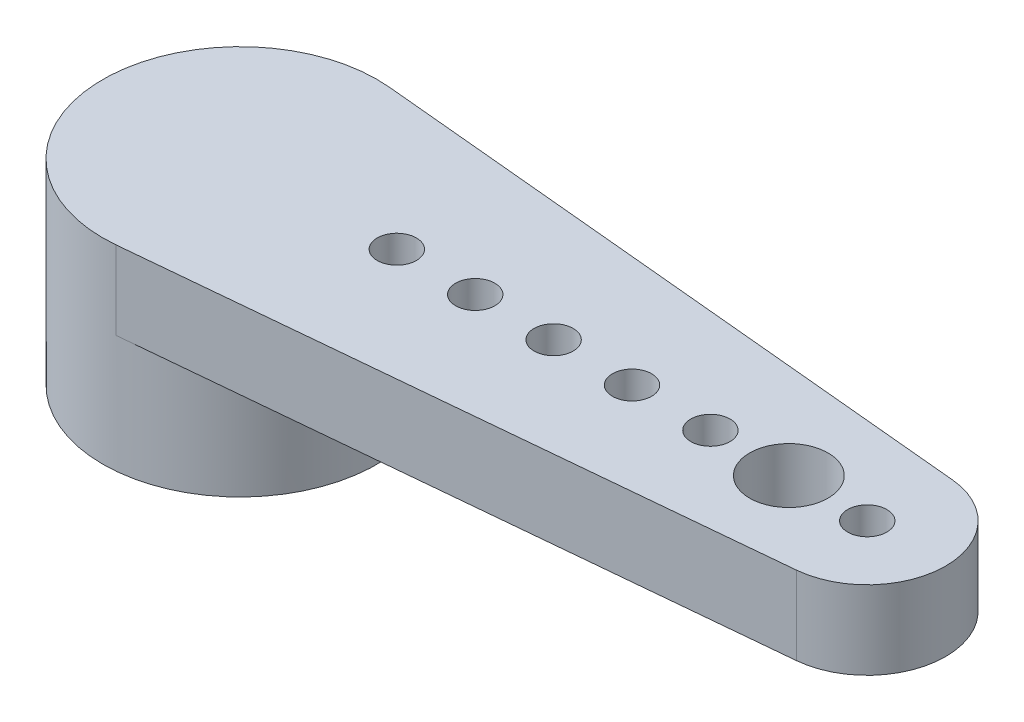
ISO-10303-21;
HEADER;
FILE_DESCRIPTION(('STEP AP214'),'2;1');
FILE_NAME('part.step','',(''),(''),'','','');
FILE_SCHEMA(('AUTOMOTIVE_DESIGN { 1 0 10303 214 1 1 1 1 }'));
ENDSEC;
DATA;
#1=APPLICATION_CONTEXT('core data for automotive mechanical design processes');
#2=APPLICATION_PROTOCOL_DEFINITION('international standard','automotive_design',2000,#1);
#3=PRODUCT_CONTEXT('',#1,'mechanical');
#4=PRODUCT('Part','Part','',(#3));
#5=PRODUCT_RELATED_PRODUCT_CATEGORY('part','',(#4));
#6=PRODUCT_DEFINITION_FORMATION('','',#4);
#7=PRODUCT_DEFINITION_CONTEXT('part definition',#1,'design');
#8=PRODUCT_DEFINITION('design','',#6,#7);
#9=PRODUCT_DEFINITION_SHAPE('','',#8);
#10=(LENGTH_UNIT() NAMED_UNIT(*) SI_UNIT(.MILLI.,.METRE.));
#11=(NAMED_UNIT(*) PLANE_ANGLE_UNIT() SI_UNIT($,.RADIAN.));
#12=(NAMED_UNIT(*) SI_UNIT($,.STERADIAN.) SOLID_ANGLE_UNIT());
#13=UNCERTAINTY_MEASURE_WITH_UNIT(LENGTH_MEASURE(1.E-05),#10,'distance_accuracy_value','');
#14=(GEOMETRIC_REPRESENTATION_CONTEXT(3) GLOBAL_UNCERTAINTY_ASSIGNED_CONTEXT((#13)) GLOBAL_UNIT_ASSIGNED_CONTEXT((#10,
#11,#12)) REPRESENTATION_CONTEXT('',''));
#15=CARTESIAN_POINT('',(0.,0.,0.));
#16=DIRECTION('',(0.,0.,1.));
#17=DIRECTION('',(1.,0.,0.));
#18=AXIS2_PLACEMENT_3D('',#15,#16,#17);
#19=CARTESIAN_POINT('',(0.,0.,0.));
#20=DIRECTION('',(0.,1.,0.));
#21=DIRECTION('',(0.,0.,1.));
#22=AXIS2_PLACEMENT_3D('',#19,#20,#21);
#23=PLANE('',#22);
#24=CARTESIAN_POINT('',(0.,0.,0.));
#25=DIRECTION('',(0.,1.,0.));
#26=DIRECTION('',(0.,0.,1.));
#27=AXIS2_PLACEMENT_3D('',#24,#25,#26);
#28=CIRCLE('',#27,3.5);
#29=CARTESIAN_POINT('',(0.,0.,3.5));
#30=VERTEX_POINT('',#29);
#31=EDGE_CURVE('E43',#30,#30,#28,.T.);
#32=ORIENTED_EDGE('',*,*,#31,.F.);
#33=EDGE_LOOP('',(#32));
#34=FACE_BOUND('',#33,.T.);
#35=CARTESIAN_POINT('',(0.,0.,0.));
#36=DIRECTION('',(0.,1.,0.));
#37=DIRECTION('',(0.,0.,1.));
#38=AXIS2_PLACEMENT_3D('',#35,#36,#37);
#39=CIRCLE('',#38,2.4);
#40=CARTESIAN_POINT('',(0.,0.,2.4));
#41=VERTEX_POINT('',#40);
#42=EDGE_CURVE('E117',#41,#41,#39,.T.);
#43=ORIENTED_EDGE('',*,*,#42,.T.);
#44=EDGE_LOOP('',(#43));
#45=FACE_BOUND('',#44,.T.);
#46=ADVANCED_FACE('F39',(#34,#45),#23,.F.);
#47=CARTESIAN_POINT('',(0.,3.,0.));
#48=DIRECTION('',(0.,-1.,0.));
#49=DIRECTION('',(0.,0.,-1.));
#50=AXIS2_PLACEMENT_3D('',#47,#48,#49);
#51=CYLINDRICAL_SURFACE('',#50,3.5);
#52=CARTESIAN_POINT('',(0.,3.,0.));
#53=DIRECTION('',(0.,1.,0.));
#54=DIRECTION('',(0.,0.,1.));
#55=AXIS2_PLACEMENT_3D('',#52,#53,#54);
#56=CIRCLE('',#55,3.5);
#57=CARTESIAN_POINT('',(0.328125,3.,3.48458519545369));
#58=VERTEX_POINT('',#57);
#59=CARTESIAN_POINT('',(3.5,3.,0.));
#60=VERTEX_POINT('',#59);
#61=EDGE_CURVE('E11',#58,#60,#56,.T.);
#62=ORIENTED_EDGE('',*,*,#61,.F.);
#63=DIRECTION('',(0.,-1.,0.));
#64=VECTOR('',#63,1.);
#65=CARTESIAN_POINT('',(0.328125,5.,3.48458519545369));
#66=LINE('',#65,#64);
#67=CARTESIAN_POINT('',(0.328125,5.,3.48458519545369));
#68=VERTEX_POINT('',#67);
#69=EDGE_CURVE('E335',#68,#58,#66,.T.);
#70=ORIENTED_EDGE('',*,*,#69,.F.);
#71=CARTESIAN_POINT('',(0.,5.,0.));
#72=DIRECTION('',(0.,1.,0.));
#73=DIRECTION('',(0.,0.,1.));
#74=AXIS2_PLACEMENT_3D('',#71,#72,#73);
#75=CIRCLE('',#74,3.5);
#76=CARTESIAN_POINT('',(0.328125,5.,-3.48458519545369));
#77=VERTEX_POINT('',#76);
#78=EDGE_CURVE('E101',#77,#68,#75,.T.);
#79=ORIENTED_EDGE('',*,*,#78,.F.);
#80=DIRECTION('',(0.,-1.,0.));
#81=VECTOR('',#80,1.);
#82=CARTESIAN_POINT('',(0.328125,5.,-3.48458519545369));
#83=LINE('',#82,#81);
#84=CARTESIAN_POINT('',(0.328125,3.,-3.48458519545368));
#85=VERTEX_POINT('',#84);
#86=EDGE_CURVE('E119',#77,#85,#83,.T.);
#87=ORIENTED_EDGE('',*,*,#86,.T.);
#88=EDGE_CURVE('E49',#60,#85,#56,.T.);
#89=ORIENTED_EDGE('',*,*,#88,.F.);
#90=EDGE_LOOP('',(#62,#70,#79,#87,#89));
#91=FACE_BOUND('',#90,.T.);
#92=ORIENTED_EDGE('',*,*,#31,.T.);
#93=EDGE_LOOP('',(#92));
#94=FACE_BOUND('',#93,.T.);
#95=ADVANCED_FACE('F41',(#91,#94),#51,.T.);
#96=CARTESIAN_POINT('',(0.,3.,0.));
#97=DIRECTION('',(0.,-1.,0.));
#98=DIRECTION('',(0.,0.,-1.));
#99=AXIS2_PLACEMENT_3D('',#96,#97,#98);
#100=CYLINDRICAL_SURFACE('',#99,2.4);
#101=CARTESIAN_POINT('',(0.,3.,0.));
#102=DIRECTION('',(0.,1.,0.));
#103=DIRECTION('',(0.,0.,1.));
#104=AXIS2_PLACEMENT_3D('',#101,#102,#103);
#105=CIRCLE('',#104,2.4);
#106=CARTESIAN_POINT('',(0.,3.,2.4));
#107=VERTEX_POINT('',#106);
#108=EDGE_CURVE('E112',#107,#107,#105,.T.);
#109=ORIENTED_EDGE('',*,*,#108,.T.);
#110=EDGE_LOOP('',(#109));
#111=FACE_BOUND('',#110,.T.);
#112=ORIENTED_EDGE('',*,*,#42,.F.);
#113=EDGE_LOOP('',(#112));
#114=FACE_BOUND('',#113,.T.);
#115=ADVANCED_FACE('F137',(#111,#114),#100,.F.);
#116=CARTESIAN_POINT('',(0.,3.,0.));
#117=DIRECTION('',(0.,1.,0.));
#118=DIRECTION('',(0.,0.,1.));
#119=AXIS2_PLACEMENT_3D('',#116,#117,#118);
#120=PLANE('',#119);
#121=ORIENTED_EDGE('',*,*,#108,.F.);
#122=EDGE_LOOP('',(#121));
#123=FACE_BOUND('',#122,.T.);
#124=ADVANCED_FACE('F141',(#123),#120,.F.);
#125=CARTESIAN_POINT('',(0.328125,5.,3.48458519545369));
#126=DIRECTION('',(-0.09375,0.,-0.995595770129625));
#127=DIRECTION('',(-0.995595770129625,0.,0.09375));
#128=AXIS2_PLACEMENT_3D('',#125,#126,#127);
#129=PLANE('',#128);
#130=DIRECTION('',(0.995595770129624,0.,-0.09375));
#131=VECTOR('',#130,1.);
#132=CARTESIAN_POINT('',(0.328125,3.,3.48458519545369));
#133=LINE('',#132,#131);
#134=CARTESIAN_POINT('',(16.1875,3.,1.99119154025925));
#135=VERTEX_POINT('',#134);
#136=EDGE_CURVE('E110',#58,#135,#133,.T.);
#137=ORIENTED_EDGE('',*,*,#136,.T.);
#138=DIRECTION('',(0.,-1.,0.));
#139=VECTOR('',#138,1.);
#140=CARTESIAN_POINT('',(16.1875,5.,1.99119154025925));
#141=LINE('',#140,#139);
#142=CARTESIAN_POINT('',(16.1875,5.,1.99119154025925));
#143=VERTEX_POINT('',#142);
#144=EDGE_CURVE('E87',#143,#135,#141,.T.);
#145=ORIENTED_EDGE('',*,*,#144,.F.);
#146=DIRECTION('',(0.995595770129624,0.,-0.09375));
#147=VECTOR('',#146,1.);
#148=CARTESIAN_POINT('',(0.328125,5.,3.48458519545369));
#149=LINE('',#148,#147);
#150=EDGE_CURVE('E95',#68,#143,#149,.T.);
#151=ORIENTED_EDGE('',*,*,#150,.F.);
#152=ORIENTED_EDGE('',*,*,#69,.T.);
#153=EDGE_LOOP('',(#137,#145,#151,#152));
#154=FACE_BOUND('',#153,.T.);
#155=ADVANCED_FACE('F108',(#154),#129,.F.);
#156=CARTESIAN_POINT('',(16.,5.,0.));
#157=DIRECTION('',(0.,-1.,0.));
#158=DIRECTION('',(0.,0.,-1.));
#159=AXIS2_PLACEMENT_3D('',#156,#157,#158);
#160=CYLINDRICAL_SURFACE('',#159,2.);
#161=CARTESIAN_POINT('',(16.,3.,0.));
#162=DIRECTION('',(0.,1.,0.));
#163=DIRECTION('',(0.,0.,1.));
#164=AXIS2_PLACEMENT_3D('',#161,#162,#163);
#165=CIRCLE('',#164,2.);
#166=CARTESIAN_POINT('',(16.1875,3.,-1.99119154025925));
#167=VERTEX_POINT('',#166);
#168=EDGE_CURVE('E343',#135,#167,#165,.T.);
#169=ORIENTED_EDGE('',*,*,#168,.T.);
#170=DIRECTION('',(0.,-1.,0.));
#171=VECTOR('',#170,1.);
#172=CARTESIAN_POINT('',(16.1875,5.,-1.99119154025925));
#173=LINE('',#172,#171);
#174=CARTESIAN_POINT('',(16.1875,5.,-1.99119154025925));
#175=VERTEX_POINT('',#174);
#176=EDGE_CURVE('E89',#175,#167,#173,.T.);
#177=ORIENTED_EDGE('',*,*,#176,.F.);
#178=CARTESIAN_POINT('',(16.,5.,0.));
#179=DIRECTION('',(0.,1.,0.));
#180=DIRECTION('',(0.,0.,1.));
#181=AXIS2_PLACEMENT_3D('',#178,#179,#180);
#182=CIRCLE('',#181,2.);
#183=EDGE_CURVE('E82',#143,#175,#182,.T.);
#184=ORIENTED_EDGE('',*,*,#183,.F.);
#185=ORIENTED_EDGE('',*,*,#144,.T.);
#186=EDGE_LOOP('',(#169,#177,#184,#185));
#187=FACE_BOUND('',#186,.T.);
#188=ADVANCED_FACE('F85',(#187),#160,.T.);
#189=CARTESIAN_POINT('',(0.328125,5.,-3.48458519545368));
#190=DIRECTION('',(0.09375,0.,-0.995595770129625));
#191=DIRECTION('',(-0.995595770129625,0.,-0.09375));
#192=AXIS2_PLACEMENT_3D('',#189,#190,#191);
#193=PLANE('',#192);
#194=DIRECTION('',(0.995595770129624,0.,0.09375));
#195=VECTOR('',#194,1.);
#196=CARTESIAN_POINT('',(0.328125,3.,-3.48458519545368));
#197=LINE('',#196,#195);
#198=EDGE_CURVE('E340',#85,#167,#197,.T.);
#199=ORIENTED_EDGE('',*,*,#198,.F.);
#200=ORIENTED_EDGE('',*,*,#86,.F.);
#201=DIRECTION('',(0.995595770129624,0.,0.09375));
#202=VECTOR('',#201,1.);
#203=CARTESIAN_POINT('',(0.328125,5.,-3.48458519545368));
#204=LINE('',#203,#202);
#205=EDGE_CURVE('E94',#77,#175,#204,.T.);
#206=ORIENTED_EDGE('',*,*,#205,.T.);
#207=ORIENTED_EDGE('',*,*,#176,.T.);
#208=EDGE_LOOP('',(#199,#200,#206,#207));
#209=FACE_BOUND('',#208,.T.);
#210=ADVANCED_FACE('F147',(#209),#193,.T.);
#211=CARTESIAN_POINT('',(12.,5.,0.));
#212=DIRECTION('',(0.,-1.,0.));
#213=DIRECTION('',(0.,0.,-1.));
#214=AXIS2_PLACEMENT_3D('',#211,#212,#213);
#215=CYLINDRICAL_SURFACE('',#214,0.500000000000001);
#216=CARTESIAN_POINT('',(12.,5.,0.));
#217=DIRECTION('',(0.,1.,0.));
#218=DIRECTION('',(0.,0.,1.));
#219=AXIS2_PLACEMENT_3D('',#216,#217,#218);
#220=CIRCLE('',#219,0.500000000000001);
#221=CARTESIAN_POINT('',(12.,5.,0.500000000000001));
#222=VERTEX_POINT('',#221);
#223=EDGE_CURVE('E362',#222,#222,#220,.T.);
#224=ORIENTED_EDGE('',*,*,#223,.T.);
#225=EDGE_LOOP('',(#224));
#226=FACE_BOUND('',#225,.T.);
#227=CARTESIAN_POINT('',(12.,3.,0.));
#228=DIRECTION('',(0.,1.,0.));
#229=DIRECTION('',(0.,0.,1.));
#230=AXIS2_PLACEMENT_3D('',#227,#228,#229);
#231=CIRCLE('',#230,0.500000000000001);
#232=CARTESIAN_POINT('',(12.,3.,0.500000000000001));
#233=VERTEX_POINT('',#232);
#234=EDGE_CURVE('E325',#233,#233,#231,.T.);
#235=ORIENTED_EDGE('',*,*,#234,.F.);
#236=EDGE_LOOP('',(#235));
#237=FACE_BOUND('',#236,.T.);
#238=ADVANCED_FACE('F150',(#226,#237),#215,.F.);
#239=CARTESIAN_POINT('',(8.,5.,0.));
#240=DIRECTION('',(0.,-1.,0.));
#241=DIRECTION('',(0.,0.,-1.));
#242=AXIS2_PLACEMENT_3D('',#239,#240,#241);
#243=CYLINDRICAL_SURFACE('',#242,0.500000000000001);
#244=CARTESIAN_POINT('',(8.,5.,0.));
#245=DIRECTION('',(0.,1.,0.));
#246=DIRECTION('',(0.,0.,1.));
#247=AXIS2_PLACEMENT_3D('',#244,#245,#246);
#248=CIRCLE('',#247,0.500000000000001);
#249=CARTESIAN_POINT('',(8.,5.,0.500000000000029));
#250=VERTEX_POINT('',#249);
#251=EDGE_CURVE('E366',#250,#250,#248,.T.);
#252=ORIENTED_EDGE('',*,*,#251,.T.);
#253=EDGE_LOOP('',(#252));
#254=FACE_BOUND('',#253,.T.);
#255=CARTESIAN_POINT('',(8.,3.,0.));
#256=DIRECTION('',(0.,1.,0.));
#257=DIRECTION('',(0.,0.,1.));
#258=AXIS2_PLACEMENT_3D('',#255,#256,#257);
#259=CIRCLE('',#258,0.500000000000001);
#260=CARTESIAN_POINT('',(8.,3.,0.500000000000029));
#261=VERTEX_POINT('',#260);
#262=EDGE_CURVE('E321',#261,#261,#259,.T.);
#263=ORIENTED_EDGE('',*,*,#262,.F.);
#264=EDGE_LOOP('',(#263));
#265=FACE_BOUND('',#264,.T.);
#266=ADVANCED_FACE('F168',(#254,#265),#243,.F.);
#267=CARTESIAN_POINT('',(6.,5.,0.));
#268=DIRECTION('',(0.,-1.,0.));
#269=DIRECTION('',(0.,0.,-1.));
#270=AXIS2_PLACEMENT_3D('',#267,#268,#269);
#271=CYLINDRICAL_SURFACE('',#270,0.500000000000001);
#272=CARTESIAN_POINT('',(6.,5.,0.));
#273=DIRECTION('',(0.,1.,0.));
#274=DIRECTION('',(0.,0.,1.));
#275=AXIS2_PLACEMENT_3D('',#272,#273,#274);
#276=CIRCLE('',#275,0.500000000000001);
#277=CARTESIAN_POINT('',(6.,5.,0.500000000000043));
#278=VERTEX_POINT('',#277);
#279=EDGE_CURVE('E370',#278,#278,#276,.T.);
#280=ORIENTED_EDGE('',*,*,#279,.T.);
#281=EDGE_LOOP('',(#280));
#282=FACE_BOUND('',#281,.T.);
#283=CARTESIAN_POINT('',(6.,3.,0.));
#284=DIRECTION('',(0.,1.,0.));
#285=DIRECTION('',(0.,0.,1.));
#286=AXIS2_PLACEMENT_3D('',#283,#284,#285);
#287=CIRCLE('',#286,0.500000000000001);
#288=CARTESIAN_POINT('',(6.,3.,0.500000000000043));
#289=VERTEX_POINT('',#288);
#290=EDGE_CURVE('E317',#289,#289,#287,.T.);
#291=ORIENTED_EDGE('',*,*,#290,.F.);
#292=EDGE_LOOP('',(#291));
#293=FACE_BOUND('',#292,.T.);
#294=ADVANCED_FACE('F164',(#282,#293),#271,.F.);
#295=CARTESIAN_POINT('',(10.,5.,0.));
#296=DIRECTION('',(0.,-1.,0.));
#297=DIRECTION('',(0.,0.,-1.));
#298=AXIS2_PLACEMENT_3D('',#295,#296,#297);
#299=CYLINDRICAL_SURFACE('',#298,0.500000000000001);
#300=CARTESIAN_POINT('',(10.,5.,0.));
#301=DIRECTION('',(0.,1.,0.));
#302=DIRECTION('',(0.,0.,1.));
#303=AXIS2_PLACEMENT_3D('',#300,#301,#302);
#304=CIRCLE('',#303,0.500000000000001);
#305=CARTESIAN_POINT('',(10.,5.,0.500000000000015));
#306=VERTEX_POINT('',#305);
#307=EDGE_CURVE('E374',#306,#306,#304,.T.);
#308=ORIENTED_EDGE('',*,*,#307,.T.);
#309=EDGE_LOOP('',(#308));
#310=FACE_BOUND('',#309,.T.);
#311=CARTESIAN_POINT('',(10.,3.,0.));
#312=DIRECTION('',(0.,1.,0.));
#313=DIRECTION('',(0.,0.,1.));
#314=AXIS2_PLACEMENT_3D('',#311,#312,#313);
#315=CIRCLE('',#314,0.500000000000001);
#316=CARTESIAN_POINT('',(10.,3.,0.500000000000015));
#317=VERTEX_POINT('',#316);
#318=EDGE_CURVE('E313',#317,#317,#315,.T.);
#319=ORIENTED_EDGE('',*,*,#318,.F.);
#320=EDGE_LOOP('',(#319));
#321=FACE_BOUND('',#320,.T.);
#322=ADVANCED_FACE('F160',(#310,#321),#299,.F.);
#323=CARTESIAN_POINT('',(14.,5.,0.));
#324=DIRECTION('',(0.,-1.,0.));
#325=DIRECTION('',(0.,0.,-1.));
#326=AXIS2_PLACEMENT_3D('',#323,#324,#325);
#327=CYLINDRICAL_SURFACE('',#326,1.);
#328=CARTESIAN_POINT('',(14.,5.,0.));
#329=DIRECTION('',(0.,1.,0.));
#330=DIRECTION('',(0.,0.,1.));
#331=AXIS2_PLACEMENT_3D('',#328,#329,#330);
#332=CIRCLE('',#331,1.);
#333=CARTESIAN_POINT('',(14.,5.,1.));
#334=VERTEX_POINT('',#333);
#335=EDGE_CURVE('E378',#334,#334,#332,.T.);
#336=ORIENTED_EDGE('',*,*,#335,.T.);
#337=EDGE_LOOP('',(#336));
#338=FACE_BOUND('',#337,.T.);
#339=CARTESIAN_POINT('',(14.,3.,0.));
#340=DIRECTION('',(0.,1.,0.));
#341=DIRECTION('',(0.,0.,1.));
#342=AXIS2_PLACEMENT_3D('',#339,#340,#341);
#343=CIRCLE('',#342,1.);
#344=CARTESIAN_POINT('',(14.,3.,1.));
#345=VERTEX_POINT('',#344);
#346=EDGE_CURVE('E309',#345,#345,#343,.T.);
#347=ORIENTED_EDGE('',*,*,#346,.F.);
#348=EDGE_LOOP('',(#347));
#349=FACE_BOUND('',#348,.T.);
#350=ADVANCED_FACE('F156',(#338,#349),#327,.F.);
#351=CARTESIAN_POINT('',(4.,5.,0.));
#352=DIRECTION('',(0.,-1.,0.));
#353=DIRECTION('',(0.,0.,-1.));
#354=AXIS2_PLACEMENT_3D('',#351,#352,#353);
#355=CYLINDRICAL_SURFACE('',#354,0.500000000000001);
#356=CARTESIAN_POINT('',(4.,5.,0.));
#357=DIRECTION('',(0.,1.,0.));
#358=DIRECTION('',(0.,0.,1.));
#359=AXIS2_PLACEMENT_3D('',#356,#357,#358);
#360=CIRCLE('',#359,0.500000000000001);
#361=CARTESIAN_POINT('',(4.,5.,0.500000000000057));
#362=VERTEX_POINT('',#361);
#363=EDGE_CURVE('E382',#362,#362,#360,.T.);
#364=ORIENTED_EDGE('',*,*,#363,.T.);
#365=EDGE_LOOP('',(#364));
#366=FACE_BOUND('',#365,.T.);
#367=CARTESIAN_POINT('',(4.,3.,0.));
#368=DIRECTION('',(0.,1.,0.));
#369=DIRECTION('',(0.,0.,1.));
#370=AXIS2_PLACEMENT_3D('',#367,#368,#369);
#371=CIRCLE('',#370,0.500000000000001);
#372=EDGE_CURVE('E342',#60,#60,#371,.T.);
#373=ORIENTED_EDGE('',*,*,#372,.F.);
#374=EDGE_LOOP('',(#373));
#375=FACE_BOUND('',#374,.T.);
#376=ADVANCED_FACE('F152',(#366,#375),#355,.F.);
#377=CARTESIAN_POINT('',(16.,5.,0.));
#378=DIRECTION('',(0.,-1.,0.));
#379=DIRECTION('',(0.,0.,-1.));
#380=AXIS2_PLACEMENT_3D('',#377,#378,#379);
#381=CYLINDRICAL_SURFACE('',#380,0.499999999999999);
#382=CARTESIAN_POINT('',(16.,5.,0.));
#383=DIRECTION('',(0.,1.,0.));
#384=DIRECTION('',(0.,0.,1.));
#385=AXIS2_PLACEMENT_3D('',#382,#383,#384);
#386=CIRCLE('',#385,0.499999999999999);
#387=CARTESIAN_POINT('',(16.,5.,0.499999999999999));
#388=VERTEX_POINT('',#387);
#389=EDGE_CURVE('E337',#388,#388,#386,.T.);
#390=ORIENTED_EDGE('',*,*,#389,.T.);
#391=EDGE_LOOP('',(#390));
#392=FACE_BOUND('',#391,.T.);
#393=CARTESIAN_POINT('',(16.,3.,0.));
#394=DIRECTION('',(0.,1.,0.));
#395=DIRECTION('',(0.,0.,1.));
#396=AXIS2_PLACEMENT_3D('',#393,#394,#395);
#397=CIRCLE('',#396,0.499999999999999);
#398=CARTESIAN_POINT('',(16.,3.,0.499999999999999));
#399=VERTEX_POINT('',#398);
#400=EDGE_CURVE('E106',#399,#399,#397,.T.);
#401=ORIENTED_EDGE('',*,*,#400,.F.);
#402=EDGE_LOOP('',(#401));
#403=FACE_BOUND('',#402,.T.);
#404=ADVANCED_FACE('F155',(#392,#403),#381,.F.);
#405=CARTESIAN_POINT('',(0.,5.,0.));
#406=DIRECTION('',(0.,1.,0.));
#407=DIRECTION('',(0.,0.,1.));
#408=AXIS2_PLACEMENT_3D('',#405,#406,#407);
#409=PLANE('',#408);
#410=ORIENTED_EDGE('',*,*,#150,.T.);
#411=ORIENTED_EDGE('',*,*,#183,.T.);
#412=ORIENTED_EDGE('',*,*,#205,.F.);
#413=ORIENTED_EDGE('',*,*,#78,.T.);
#414=EDGE_LOOP('',(#410,#411,#412,#413));
#415=FACE_BOUND('',#414,.T.);
#416=ORIENTED_EDGE('',*,*,#363,.F.);
#417=EDGE_LOOP('',(#416));
#418=FACE_BOUND('',#417,.T.);
#419=ORIENTED_EDGE('',*,*,#335,.F.);
#420=EDGE_LOOP('',(#419));
#421=FACE_BOUND('',#420,.T.);
#422=ORIENTED_EDGE('',*,*,#307,.F.);
#423=EDGE_LOOP('',(#422));
#424=FACE_BOUND('',#423,.T.);
#425=ORIENTED_EDGE('',*,*,#279,.F.);
#426=EDGE_LOOP('',(#425));
#427=FACE_BOUND('',#426,.T.);
#428=ORIENTED_EDGE('',*,*,#251,.F.);
#429=EDGE_LOOP('',(#428));
#430=FACE_BOUND('',#429,.T.);
#431=ORIENTED_EDGE('',*,*,#223,.F.);
#432=EDGE_LOOP('',(#431));
#433=FACE_BOUND('',#432,.T.);
#434=ORIENTED_EDGE('',*,*,#389,.F.);
#435=EDGE_LOOP('',(#434));
#436=FACE_BOUND('',#435,.T.);
#437=ADVANCED_FACE('F98',(#415,#418,#421,#424,#427,#430,#433,#436),#409,.T.);
#438=ORIENTED_EDGE('',*,*,#136,.F.);
#439=ORIENTED_EDGE('',*,*,#61,.T.);
#440=ORIENTED_EDGE('',*,*,#372,.T.);
#441=ORIENTED_EDGE('',*,*,#88,.T.);
#442=ORIENTED_EDGE('',*,*,#198,.T.);
#443=ORIENTED_EDGE('',*,*,#168,.F.);
#444=EDGE_LOOP('',(#438,#439,#440,#441,#442,#443));
#445=FACE_BOUND('',#444,.T.);
#446=ORIENTED_EDGE('',*,*,#346,.T.);
#447=EDGE_LOOP('',(#446));
#448=FACE_BOUND('',#447,.T.);
#449=ORIENTED_EDGE('',*,*,#318,.T.);
#450=EDGE_LOOP('',(#449));
#451=FACE_BOUND('',#450,.T.);
#452=ORIENTED_EDGE('',*,*,#290,.T.);
#453=EDGE_LOOP('',(#452));
#454=FACE_BOUND('',#453,.T.);
#455=ORIENTED_EDGE('',*,*,#262,.T.);
#456=EDGE_LOOP('',(#455));
#457=FACE_BOUND('',#456,.T.);
#458=ORIENTED_EDGE('',*,*,#234,.T.);
#459=EDGE_LOOP('',(#458));
#460=FACE_BOUND('',#459,.T.);
#461=ORIENTED_EDGE('',*,*,#400,.T.);
#462=EDGE_LOOP('',(#461));
#463=FACE_BOUND('',#462,.T.);
#464=ADVANCED_FACE('F179',(#445,#448,#451,#454,#457,#460,#463),#120,.F.);
#465=CLOSED_SHELL('',(#46,#95,#115,#124,#155,#188,#210,#238,#266,#294,#322,#350,#376,#404,#437,#464));
#466=MANIFOLD_SOLID_BREP('B2',#465);
#467=ADVANCED_BREP_SHAPE_REPRESENTATION('',(#18,#466),#14);
#468=SHAPE_DEFINITION_REPRESENTATION(#9,#467);
ENDSEC;
END-ISO-10303-21;
